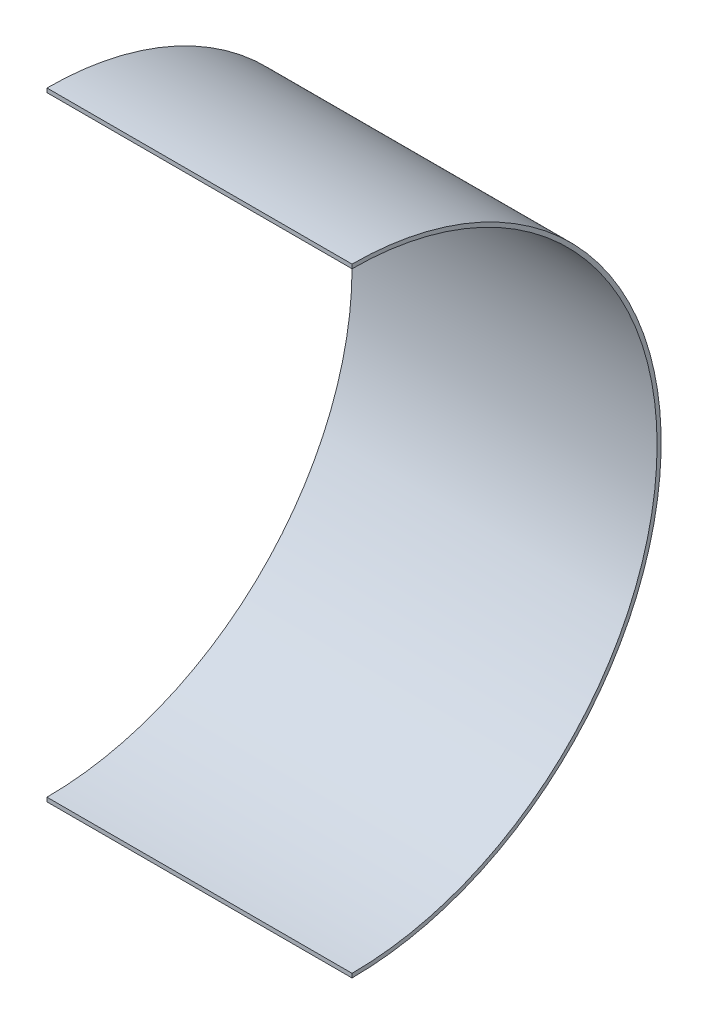
ISO-10303-21;
HEADER;
FILE_DESCRIPTION(('STEP AP214'),'2;1');
FILE_NAME('part.step','',(''),(''),'','','');
FILE_SCHEMA(('AUTOMOTIVE_DESIGN { 1 0 10303 214 1 1 1 1 }'));
ENDSEC;
DATA;
#1=APPLICATION_CONTEXT('core data for automotive mechanical design processes');
#2=APPLICATION_PROTOCOL_DEFINITION('international standard','automotive_design',2000,#1);
#3=PRODUCT_CONTEXT('',#1,'mechanical');
#4=PRODUCT('Part','Part','',(#3));
#5=PRODUCT_RELATED_PRODUCT_CATEGORY('part','',(#4));
#6=PRODUCT_DEFINITION_FORMATION('','',#4);
#7=PRODUCT_DEFINITION_CONTEXT('part definition',#1,'design');
#8=PRODUCT_DEFINITION('design','',#6,#7);
#9=PRODUCT_DEFINITION_SHAPE('','',#8);
#10=(LENGTH_UNIT() NAMED_UNIT(*) SI_UNIT(.MILLI.,.METRE.));
#11=(NAMED_UNIT(*) PLANE_ANGLE_UNIT() SI_UNIT($,.RADIAN.));
#12=(NAMED_UNIT(*) SI_UNIT($,.STERADIAN.) SOLID_ANGLE_UNIT());
#13=UNCERTAINTY_MEASURE_WITH_UNIT(LENGTH_MEASURE(1.E-05),#10,'distance_accuracy_value','');
#14=(GEOMETRIC_REPRESENTATION_CONTEXT(3) GLOBAL_UNCERTAINTY_ASSIGNED_CONTEXT((#13)) GLOBAL_UNIT_ASSIGNED_CONTEXT((#10,
#11,#12)) REPRESENTATION_CONTEXT('',''));
#15=CARTESIAN_POINT('',(0.,0.,0.));
#16=DIRECTION('',(0.,0.,1.));
#17=DIRECTION('',(1.,0.,0.));
#18=AXIS2_PLACEMENT_3D('',#15,#16,#17);
#19=CARTESIAN_POINT('',(190.5,0.,0.));
#20=DIRECTION('',(-1.,0.,0.));
#21=DIRECTION('',(0.,0.,1.));
#22=AXIS2_PLACEMENT_3D('',#19,#20,#21);
#23=CYLINDRICAL_SURFACE('',#22,193.04);
#24=CARTESIAN_POINT('',(0.,0.,0.));
#25=DIRECTION('',(1.,0.,0.));
#26=DIRECTION('',(0.,0.,-1.));
#27=AXIS2_PLACEMENT_3D('',#24,#25,#26);
#28=CIRCLE('',#27,193.04);
#29=CARTESIAN_POINT('',(0.,-193.04,0.));
#30=VERTEX_POINT('',#29);
#31=CARTESIAN_POINT('',(0.,193.04,0.));
#32=VERTEX_POINT('',#31);
#33=EDGE_CURVE('E96',#30,#32,#28,.T.);
#34=ORIENTED_EDGE('',*,*,#33,.T.);
#35=DIRECTION('',(-1.,0.,0.));
#36=VECTOR('',#35,1.);
#37=CARTESIAN_POINT('',(190.5,193.04,0.));
#38=LINE('',#37,#36);
#39=CARTESIAN_POINT('',(190.5,193.04,0.));
#40=VERTEX_POINT('',#39);
#41=EDGE_CURVE('E11',#40,#32,#38,.T.);
#42=ORIENTED_EDGE('',*,*,#41,.F.);
#43=CARTESIAN_POINT('',(190.5,0.,0.));
#44=DIRECTION('',(1.,0.,0.));
#45=DIRECTION('',(0.,0.,-1.));
#46=AXIS2_PLACEMENT_3D('',#43,#44,#45);
#47=CIRCLE('',#46,193.04);
#48=CARTESIAN_POINT('',(190.5,-193.04,0.));
#49=VERTEX_POINT('',#48);
#50=EDGE_CURVE('E73',#49,#40,#47,.T.);
#51=ORIENTED_EDGE('',*,*,#50,.F.);
#52=DIRECTION('',(-1.,0.,0.));
#53=VECTOR('',#52,1.);
#54=CARTESIAN_POINT('',(190.5,-193.04,0.));
#55=LINE('',#54,#53);
#56=EDGE_CURVE('E49',#49,#30,#55,.T.);
#57=ORIENTED_EDGE('',*,*,#56,.T.);
#58=EDGE_LOOP('',(#34,#42,#51,#57));
#59=FACE_BOUND('',#58,.T.);
#60=ADVANCED_FACE('F33',(#59),#23,.T.);
#61=CARTESIAN_POINT('',(190.5,190.5,0.));
#62=DIRECTION('',(0.,0.,1.));
#63=DIRECTION('',(0.,-1.,0.));
#64=AXIS2_PLACEMENT_3D('',#61,#62,#63);
#65=PLANE('',#64);
#66=DIRECTION('',(0.,1.,0.));
#67=VECTOR('',#66,1.);
#68=CARTESIAN_POINT('',(0.,190.5,0.));
#69=LINE('',#68,#67);
#70=CARTESIAN_POINT('',(0.,190.5,0.));
#71=VERTEX_POINT('',#70);
#72=EDGE_CURVE('E82',#71,#32,#69,.T.);
#73=ORIENTED_EDGE('',*,*,#72,.F.);
#74=DIRECTION('',(-1.,0.,0.));
#75=VECTOR('',#74,1.);
#76=CARTESIAN_POINT('',(190.5,190.5,0.));
#77=LINE('',#76,#75);
#78=CARTESIAN_POINT('',(190.5,190.5,0.));
#79=VERTEX_POINT('',#78);
#80=EDGE_CURVE('E41',#79,#71,#77,.T.);
#81=ORIENTED_EDGE('',*,*,#80,.F.);
#82=DIRECTION('',(0.,1.,0.));
#83=VECTOR('',#82,1.);
#84=CARTESIAN_POINT('',(190.5,190.5,0.));
#85=LINE('',#84,#83);
#86=EDGE_CURVE('E80',#79,#40,#85,.T.);
#87=ORIENTED_EDGE('',*,*,#86,.T.);
#88=ORIENTED_EDGE('',*,*,#41,.T.);
#89=EDGE_LOOP('',(#73,#81,#87,#88));
#90=FACE_BOUND('',#89,.T.);
#91=ADVANCED_FACE('F79',(#90),#65,.T.);
#92=CARTESIAN_POINT('',(190.5,0.,0.));
#93=DIRECTION('',(-1.,0.,0.));
#94=DIRECTION('',(0.,0.,1.));
#95=AXIS2_PLACEMENT_3D('',#92,#93,#94);
#96=CYLINDRICAL_SURFACE('',#95,190.5);
#97=CARTESIAN_POINT('',(0.,0.,0.));
#98=DIRECTION('',(1.,0.,0.));
#99=DIRECTION('',(0.,0.,-1.));
#100=AXIS2_PLACEMENT_3D('',#97,#98,#99);
#101=CIRCLE('',#100,190.5);
#102=CARTESIAN_POINT('',(0.,-190.5,0.));
#103=VERTEX_POINT('',#102);
#104=EDGE_CURVE('E99',#103,#71,#101,.T.);
#105=ORIENTED_EDGE('',*,*,#104,.F.);
#106=DIRECTION('',(-1.,0.,0.));
#107=VECTOR('',#106,1.);
#108=CARTESIAN_POINT('',(190.5,-190.5,0.));
#109=LINE('',#108,#107);
#110=CARTESIAN_POINT('',(190.5,-190.5,0.));
#111=VERTEX_POINT('',#110);
#112=EDGE_CURVE('E62',#111,#103,#109,.T.);
#113=ORIENTED_EDGE('',*,*,#112,.F.);
#114=CARTESIAN_POINT('',(190.5,0.,0.));
#115=DIRECTION('',(1.,0.,0.));
#116=DIRECTION('',(0.,0.,-1.));
#117=AXIS2_PLACEMENT_3D('',#114,#115,#116);
#118=CIRCLE('',#117,190.5);
#119=EDGE_CURVE('E88',#111,#79,#118,.T.);
#120=ORIENTED_EDGE('',*,*,#119,.T.);
#121=ORIENTED_EDGE('',*,*,#80,.T.);
#122=EDGE_LOOP('',(#105,#113,#120,#121));
#123=FACE_BOUND('',#122,.T.);
#124=ADVANCED_FACE('F90',(#123),#96,.F.);
#125=CARTESIAN_POINT('',(190.5,-193.04,0.));
#126=DIRECTION('',(0.,0.,1.));
#127=DIRECTION('',(0.,-1.,0.));
#128=AXIS2_PLACEMENT_3D('',#125,#126,#127);
#129=PLANE('',#128);
#130=DIRECTION('',(0.,1.,0.));
#131=VECTOR('',#130,1.);
#132=CARTESIAN_POINT('',(0.,-193.04,0.));
#133=LINE('',#132,#131);
#134=EDGE_CURVE('E101',#30,#103,#133,.T.);
#135=ORIENTED_EDGE('',*,*,#134,.F.);
#136=ORIENTED_EDGE('',*,*,#56,.F.);
#137=DIRECTION('',(0.,1.,0.));
#138=VECTOR('',#137,1.);
#139=CARTESIAN_POINT('',(190.5,-193.04,0.));
#140=LINE('',#139,#138);
#141=EDGE_CURVE('E91',#49,#111,#140,.T.);
#142=ORIENTED_EDGE('',*,*,#141,.T.);
#143=ORIENTED_EDGE('',*,*,#112,.T.);
#144=EDGE_LOOP('',(#135,#136,#142,#143));
#145=FACE_BOUND('',#144,.T.);
#146=ADVANCED_FACE('F107',(#145),#129,.T.);
#147=CARTESIAN_POINT('',(190.5,0.,0.));
#148=DIRECTION('',(1.,0.,0.));
#149=DIRECTION('',(0.,0.,-1.));
#150=AXIS2_PLACEMENT_3D('',#147,#148,#149);
#151=PLANE('',#150);
#152=ORIENTED_EDGE('',*,*,#50,.T.);
#153=ORIENTED_EDGE('',*,*,#86,.F.);
#154=ORIENTED_EDGE('',*,*,#119,.F.);
#155=ORIENTED_EDGE('',*,*,#141,.F.);
#156=EDGE_LOOP('',(#152,#153,#154,#155));
#157=FACE_BOUND('',#156,.T.);
#158=ADVANCED_FACE('F87',(#157),#151,.T.);
#159=CARTESIAN_POINT('',(0.,0.,0.));
#160=DIRECTION('',(1.,0.,0.));
#161=DIRECTION('',(0.,0.,-1.));
#162=AXIS2_PLACEMENT_3D('',#159,#160,#161);
#163=PLANE('',#162);
#164=ORIENTED_EDGE('',*,*,#33,.F.);
#165=ORIENTED_EDGE('',*,*,#134,.T.);
#166=ORIENTED_EDGE('',*,*,#104,.T.);
#167=ORIENTED_EDGE('',*,*,#72,.T.);
#168=EDGE_LOOP('',(#164,#165,#166,#167));
#169=FACE_BOUND('',#168,.T.);
#170=ADVANCED_FACE('F106',(#169),#163,.F.);
#171=CLOSED_SHELL('',(#60,#91,#124,#146,#158,#170));
#172=MANIFOLD_SOLID_BREP('B2',#171);
#173=ADVANCED_BREP_SHAPE_REPRESENTATION('',(#18,#172),#14);
#174=SHAPE_DEFINITION_REPRESENTATION(#9,#173);
ENDSEC;
END-ISO-10303-21;
